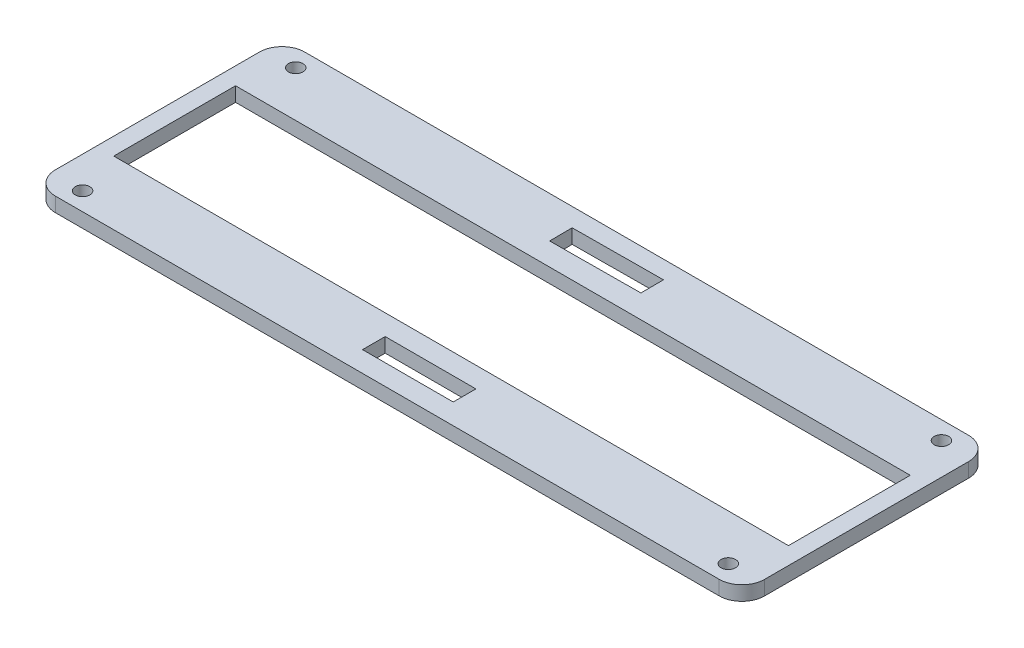
ISO-10303-21;
HEADER;
FILE_DESCRIPTION(('STEP AP214'),'2;1');
FILE_NAME('part.step','',(''),(''),'','','');
FILE_SCHEMA(('AUTOMOTIVE_DESIGN { 1 0 10303 214 1 1 1 1 }'));
ENDSEC;
DATA;
#1=APPLICATION_CONTEXT('core data for automotive mechanical design processes');
#2=APPLICATION_PROTOCOL_DEFINITION('international standard','automotive_design',2000,#1);
#3=PRODUCT_CONTEXT('',#1,'mechanical');
#4=PRODUCT('Part','Part','',(#3));
#5=PRODUCT_RELATED_PRODUCT_CATEGORY('part','',(#4));
#6=PRODUCT_DEFINITION_FORMATION('','',#4);
#7=PRODUCT_DEFINITION_CONTEXT('part definition',#1,'design');
#8=PRODUCT_DEFINITION('design','',#6,#7);
#9=PRODUCT_DEFINITION_SHAPE('','',#8);
#10=(LENGTH_UNIT() NAMED_UNIT(*) SI_UNIT(.MILLI.,.METRE.));
#11=(NAMED_UNIT(*) PLANE_ANGLE_UNIT() SI_UNIT($,.RADIAN.));
#12=(NAMED_UNIT(*) SI_UNIT($,.STERADIAN.) SOLID_ANGLE_UNIT());
#13=UNCERTAINTY_MEASURE_WITH_UNIT(LENGTH_MEASURE(1.E-05),#10,'distance_accuracy_value','');
#14=(GEOMETRIC_REPRESENTATION_CONTEXT(3) GLOBAL_UNCERTAINTY_ASSIGNED_CONTEXT((#13)) GLOBAL_UNIT_ASSIGNED_CONTEXT((#10,
#11,#12)) REPRESENTATION_CONTEXT('',''));
#15=CARTESIAN_POINT('',(0.,0.,0.));
#16=DIRECTION('',(0.,0.,1.));
#17=DIRECTION('',(1.,0.,0.));
#18=AXIS2_PLACEMENT_3D('',#15,#16,#17);
#19=CARTESIAN_POINT('',(78.2,3.175,-27.5));
#20=DIRECTION('',(-1.,0.,0.));
#21=DIRECTION('',(0.,0.,1.));
#22=AXIS2_PLACEMENT_3D('',#19,#20,#21);
#23=PLANE('',#22);
#24=DIRECTION('',(0.,0.,-1.));
#25=VECTOR('',#24,1.);
#26=CARTESIAN_POINT('',(78.2,0.,-27.5));
#27=LINE('',#26,#25);
#28=CARTESIAN_POINT('',(78.2,0.,22.5));
#29=VERTEX_POINT('',#28);
#30=CARTESIAN_POINT('',(78.2,0.,-22.5));
#31=VERTEX_POINT('',#30);
#32=EDGE_CURVE('E297',#29,#31,#27,.T.);
#33=ORIENTED_EDGE('',*,*,#32,.T.);
#34=DIRECTION('',(0.,-1.,0.));
#35=VECTOR('',#34,1.);
#36=CARTESIAN_POINT('',(78.2,3.175,-22.5));
#37=LINE('',#36,#35);
#38=CARTESIAN_POINT('',(78.2,3.175,-22.5));
#39=VERTEX_POINT('',#38);
#40=EDGE_CURVE('E43',#31,#39,#37,.F.);
#41=ORIENTED_EDGE('',*,*,#40,.T.);
#42=DIRECTION('',(0.,0.,-1.));
#43=VECTOR('',#42,1.);
#44=CARTESIAN_POINT('',(78.2,3.175,-27.5));
#45=LINE('',#44,#43);
#46=CARTESIAN_POINT('',(78.2,3.175,22.5));
#47=VERTEX_POINT('',#46);
#48=EDGE_CURVE('E304',#47,#39,#45,.T.);
#49=ORIENTED_EDGE('',*,*,#48,.F.);
#50=DIRECTION('',(0.,-1.,0.));
#51=VECTOR('',#50,1.);
#52=CARTESIAN_POINT('',(78.2,3.175,22.5));
#53=LINE('',#52,#51);
#54=EDGE_CURVE('E349',#47,#29,#53,.T.);
#55=ORIENTED_EDGE('',*,*,#54,.T.);
#56=EDGE_LOOP('',(#33,#41,#49,#55));
#57=FACE_BOUND('',#56,.T.);
#58=ADVANCED_FACE('F35',(#57),#23,.F.);
#59=CARTESIAN_POINT('',(-78.2,3.175,-27.5));
#60=DIRECTION('',(0.,0.,1.));
#61=DIRECTION('',(1.,0.,0.));
#62=AXIS2_PLACEMENT_3D('',#59,#60,#61);
#63=PLANE('',#62);
#64=DIRECTION('',(-1.,0.,0.));
#65=VECTOR('',#64,1.);
#66=CARTESIAN_POINT('',(-78.2,3.175,-27.5));
#67=LINE('',#66,#65);
#68=CARTESIAN_POINT('',(73.2,3.175,-27.5));
#69=VERTEX_POINT('',#68);
#70=CARTESIAN_POINT('',(-73.2,3.175,-27.5));
#71=VERTEX_POINT('',#70);
#72=EDGE_CURVE('E306',#69,#71,#67,.T.);
#73=ORIENTED_EDGE('',*,*,#72,.F.);
#74=DIRECTION('',(0.,-1.,0.));
#75=VECTOR('',#74,1.);
#76=CARTESIAN_POINT('',(73.2,3.175,-27.5));
#77=LINE('',#76,#75);
#78=CARTESIAN_POINT('',(73.2,0.,-27.5));
#79=VERTEX_POINT('',#78);
#80=EDGE_CURVE('E352',#69,#79,#77,.T.);
#81=ORIENTED_EDGE('',*,*,#80,.T.);
#82=DIRECTION('',(-1.,0.,0.));
#83=VECTOR('',#82,1.);
#84=CARTESIAN_POINT('',(-78.2,0.,-27.5));
#85=LINE('',#84,#83);
#86=CARTESIAN_POINT('',(-73.2,0.,-27.5));
#87=VERTEX_POINT('',#86);
#88=EDGE_CURVE('E317',#79,#87,#85,.T.);
#89=ORIENTED_EDGE('',*,*,#88,.T.);
#90=DIRECTION('',(0.,-1.,0.));
#91=VECTOR('',#90,1.);
#92=CARTESIAN_POINT('',(-73.2,3.175,-27.5));
#93=LINE('',#92,#91);
#94=EDGE_CURVE('E346',#87,#71,#93,.F.);
#95=ORIENTED_EDGE('',*,*,#94,.T.);
#96=EDGE_LOOP('',(#73,#81,#89,#95));
#97=FACE_BOUND('',#96,.T.);
#98=ADVANCED_FACE('F358',(#97),#63,.F.);
#99=CARTESIAN_POINT('',(-78.2,3.175,-27.5));
#100=DIRECTION('',(1.,0.,0.));
#101=DIRECTION('',(0.,0.,-1.));
#102=AXIS2_PLACEMENT_3D('',#99,#100,#101);
#103=PLANE('',#102);
#104=DIRECTION('',(0.,0.,1.));
#105=VECTOR('',#104,1.);
#106=CARTESIAN_POINT('',(-78.2,0.,-27.5));
#107=LINE('',#106,#105);
#108=CARTESIAN_POINT('',(-78.2,0.,-22.5));
#109=VERTEX_POINT('',#108);
#110=CARTESIAN_POINT('',(-78.2,0.,22.5));
#111=VERTEX_POINT('',#110);
#112=EDGE_CURVE('E319',#109,#111,#107,.T.);
#113=ORIENTED_EDGE('',*,*,#112,.T.);
#114=DIRECTION('',(0.,-1.,0.));
#115=VECTOR('',#114,1.);
#116=CARTESIAN_POINT('',(-78.2,3.175,22.5));
#117=LINE('',#116,#115);
#118=CARTESIAN_POINT('',(-78.2,3.175,22.5));
#119=VERTEX_POINT('',#118);
#120=EDGE_CURVE('E338',#111,#119,#117,.F.);
#121=ORIENTED_EDGE('',*,*,#120,.T.);
#122=DIRECTION('',(0.,0.,1.));
#123=VECTOR('',#122,1.);
#124=CARTESIAN_POINT('',(-78.2,3.175,-27.5));
#125=LINE('',#124,#123);
#126=CARTESIAN_POINT('',(-78.2,3.175,-22.5));
#127=VERTEX_POINT('',#126);
#128=EDGE_CURVE('E309',#127,#119,#125,.T.);
#129=ORIENTED_EDGE('',*,*,#128,.F.);
#130=DIRECTION('',(0.,-1.,0.));
#131=VECTOR('',#130,1.);
#132=CARTESIAN_POINT('',(-78.2,3.175,-22.5));
#133=LINE('',#132,#131);
#134=EDGE_CURVE('E335',#127,#109,#133,.T.);
#135=ORIENTED_EDGE('',*,*,#134,.T.);
#136=EDGE_LOOP('',(#113,#121,#129,#135));
#137=FACE_BOUND('',#136,.T.);
#138=ADVANCED_FACE('F372',(#137),#103,.F.);
#139=CARTESIAN_POINT('',(-78.2,3.175,27.5));
#140=DIRECTION('',(0.,0.,-1.));
#141=DIRECTION('',(-1.,0.,0.));
#142=AXIS2_PLACEMENT_3D('',#139,#140,#141);
#143=PLANE('',#142);
#144=DIRECTION('',(1.,0.,0.));
#145=VECTOR('',#144,1.);
#146=CARTESIAN_POINT('',(-78.2,3.175,27.5));
#147=LINE('',#146,#145);
#148=CARTESIAN_POINT('',(-73.2,3.175,27.5));
#149=VERTEX_POINT('',#148);
#150=CARTESIAN_POINT('',(73.2,3.175,27.5));
#151=VERTEX_POINT('',#150);
#152=EDGE_CURVE('E312',#149,#151,#147,.T.);
#153=ORIENTED_EDGE('',*,*,#152,.F.);
#154=DIRECTION('',(0.,-1.,0.));
#155=VECTOR('',#154,1.);
#156=CARTESIAN_POINT('',(-73.2,3.175,27.5));
#157=LINE('',#156,#155);
#158=CARTESIAN_POINT('',(-73.2,0.,27.5));
#159=VERTEX_POINT('',#158);
#160=EDGE_CURVE('E325',#149,#159,#157,.T.);
#161=ORIENTED_EDGE('',*,*,#160,.T.);
#162=DIRECTION('',(1.,0.,0.));
#163=VECTOR('',#162,1.);
#164=CARTESIAN_POINT('',(-78.2,0.,27.5));
#165=LINE('',#164,#163);
#166=CARTESIAN_POINT('',(73.2,0.,27.5));
#167=VERTEX_POINT('',#166);
#168=EDGE_CURVE('E307',#159,#167,#165,.T.);
#169=ORIENTED_EDGE('',*,*,#168,.T.);
#170=DIRECTION('',(0.,-1.,0.));
#171=VECTOR('',#170,1.);
#172=CARTESIAN_POINT('',(73.2,3.175,27.5));
#173=LINE('',#172,#171);
#174=EDGE_CURVE('E315',#167,#151,#173,.F.);
#175=ORIENTED_EDGE('',*,*,#174,.T.);
#176=EDGE_LOOP('',(#153,#161,#169,#175));
#177=FACE_BOUND('',#176,.T.);
#178=ADVANCED_FACE('F380',(#177),#143,.F.);
#179=CARTESIAN_POINT('',(0.,3.175,0.));
#180=DIRECTION('',(0.,1.,0.));
#181=DIRECTION('',(0.,0.,1.));
#182=AXIS2_PLACEMENT_3D('',#179,#180,#181);
#183=PLANE('',#182);
#184=DIRECTION('',(-0.999977725517235,0.,0.00667446397672328));
#185=VECTOR('',#184,1.);
#186=CARTESIAN_POINT('',(-10.15479818495,3.175,-23.4196869097158));
#187=LINE('',#186,#185);
#188=CARTESIAN_POINT('',(9.8447563253947,3.175,-23.5531761892503));
#189=VERTEX_POINT('',#188);
#190=CARTESIAN_POINT('',(-10.15479818495,3.175,-23.4196869097158));
#191=VERTEX_POINT('',#190);
#192=EDGE_CURVE('E179',#189,#191,#187,.T.);
#193=ORIENTED_EDGE('',*,*,#192,.F.);
#194=DIRECTION('',(-0.00667446397672467,0.,-0.999977725517236));
#195=VECTOR('',#194,1.);
#196=CARTESIAN_POINT('',(9.8447563253947,3.175,-23.5531761892503));
#197=LINE('',#196,#195);
#198=CARTESIAN_POINT('',(9.87812864527832,3.175,-18.5532875616641));
#199=VERTEX_POINT('',#198);
#200=EDGE_CURVE('E197',#199,#189,#197,.T.);
#201=ORIENTED_EDGE('',*,*,#200,.F.);
#202=DIRECTION('',(0.999977725517235,0.,-0.00667446397672363));
#203=VECTOR('',#202,1.);
#204=CARTESIAN_POINT('',(-10.1214258650664,3.175,-18.4197982821296));
#205=LINE('',#204,#203);
#206=CARTESIAN_POINT('',(-10.1214258650664,3.175,-18.4197982821296));
#207=VERTEX_POINT('',#206);
#208=EDGE_CURVE('E200',#207,#199,#205,.T.);
#209=ORIENTED_EDGE('',*,*,#208,.F.);
#210=DIRECTION('',(0.00667446397672466,0.,0.999977725517236));
#211=VECTOR('',#210,1.);
#212=CARTESIAN_POINT('',(-10.15479818495,3.175,-23.4196869097158));
#213=LINE('',#212,#211);
#214=EDGE_CURVE('E206',#191,#207,#213,.T.);
#215=ORIENTED_EDGE('',*,*,#214,.F.);
#216=EDGE_LOOP('',(#193,#201,#209,#215));
#217=FACE_BOUND('',#216,.T.);
#218=DIRECTION('',(0.,0.,-1.));
#219=VECTOR('',#218,1.);
#220=CARTESIAN_POINT('',(9.99999999999999,3.175,22.965));
#221=LINE('',#220,#219);
#222=CARTESIAN_POINT('',(9.99999999999999,3.175,22.965));
#223=VERTEX_POINT('',#222);
#224=CARTESIAN_POINT('',(9.99999999999999,3.175,17.965));
#225=VERTEX_POINT('',#224);
#226=EDGE_CURVE('E212',#223,#225,#221,.T.);
#227=ORIENTED_EDGE('',*,*,#226,.F.);
#228=DIRECTION('',(1.,0.,0.));
#229=VECTOR('',#228,1.);
#230=CARTESIAN_POINT('',(-10.,3.175,22.965));
#231=LINE('',#230,#229);
#232=CARTESIAN_POINT('',(-10.,3.175,22.965));
#233=VERTEX_POINT('',#232);
#234=EDGE_CURVE('E220',#233,#223,#231,.T.);
#235=ORIENTED_EDGE('',*,*,#234,.F.);
#236=DIRECTION('',(0.,0.,1.));
#237=VECTOR('',#236,1.);
#238=CARTESIAN_POINT('',(-10.,3.175,22.965));
#239=LINE('',#238,#237);
#240=CARTESIAN_POINT('',(-10.,3.175,17.965));
#241=VERTEX_POINT('',#240);
#242=EDGE_CURVE('E234',#241,#233,#239,.T.);
#243=ORIENTED_EDGE('',*,*,#242,.F.);
#244=DIRECTION('',(-1.,0.,0.));
#245=VECTOR('',#244,1.);
#246=CARTESIAN_POINT('',(-10.,3.175,17.965));
#247=LINE('',#246,#245);
#248=EDGE_CURVE('E231',#225,#241,#247,.T.);
#249=ORIENTED_EDGE('',*,*,#248,.F.);
#250=EDGE_LOOP('',(#227,#235,#243,#249));
#251=FACE_BOUND('',#250,.T.);
#252=CARTESIAN_POINT('',(71.2,3.175,23.5));
#253=DIRECTION('',(0.,1.,0.));
#254=DIRECTION('',(0.,0.,-1.));
#255=AXIS2_PLACEMENT_3D('',#252,#253,#254);
#256=CIRCLE('',#255,1.6);
#257=CARTESIAN_POINT('',(71.2,3.175,21.9));
#258=VERTEX_POINT('',#257);
#259=EDGE_CURVE('E241',#258,#258,#256,.T.);
#260=ORIENTED_EDGE('',*,*,#259,.F.);
#261=EDGE_LOOP('',(#260));
#262=FACE_BOUND('',#261,.T.);
#263=CARTESIAN_POINT('',(71.2,3.175,-23.5));
#264=DIRECTION('',(0.,1.,0.));
#265=DIRECTION('',(0.,0.,1.));
#266=AXIS2_PLACEMENT_3D('',#263,#264,#265);
#267=CIRCLE('',#266,1.6);
#268=CARTESIAN_POINT('',(71.2,3.175,-21.9));
#269=VERTEX_POINT('',#268);
#270=EDGE_CURVE('E251',#269,#269,#267,.T.);
#271=ORIENTED_EDGE('',*,*,#270,.F.);
#272=EDGE_LOOP('',(#271));
#273=FACE_BOUND('',#272,.T.);
#274=CARTESIAN_POINT('',(-71.2,3.175,-23.5));
#275=DIRECTION('',(0.,1.,0.));
#276=DIRECTION('',(0.,0.,-1.));
#277=AXIS2_PLACEMENT_3D('',#274,#275,#276);
#278=CIRCLE('',#277,1.6);
#279=CARTESIAN_POINT('',(-71.2,3.175,-25.1));
#280=VERTEX_POINT('',#279);
#281=EDGE_CURVE('E257',#280,#280,#278,.T.);
#282=ORIENTED_EDGE('',*,*,#281,.F.);
#283=EDGE_LOOP('',(#282));
#284=FACE_BOUND('',#283,.T.);
#285=CARTESIAN_POINT('',(-71.2,3.175,23.5));
#286=DIRECTION('',(0.,1.,0.));
#287=DIRECTION('',(0.,0.,1.));
#288=AXIS2_PLACEMENT_3D('',#285,#286,#287);
#289=CIRCLE('',#288,1.6);
#290=CARTESIAN_POINT('',(-71.2,3.175,25.1));
#291=VERTEX_POINT('',#290);
#292=EDGE_CURVE('E263',#291,#291,#289,.T.);
#293=ORIENTED_EDGE('',*,*,#292,.F.);
#294=EDGE_LOOP('',(#293));
#295=FACE_BOUND('',#294,.T.);
#296=DIRECTION('',(0.,0.,-1.));
#297=VECTOR('',#296,1.);
#298=CARTESIAN_POINT('',(-74.39,3.175,13.4299999999999));
#299=LINE('',#298,#297);
#300=CARTESIAN_POINT('',(-74.39,3.175,13.4299999999999));
#301=VERTEX_POINT('',#300);
#302=CARTESIAN_POINT('',(-74.39,3.175,-13.4300000000001));
#303=VERTEX_POINT('',#302);
#304=EDGE_CURVE('E272',#301,#303,#299,.T.);
#305=ORIENTED_EDGE('',*,*,#304,.T.);
#306=DIRECTION('',(1.,0.,0.));
#307=VECTOR('',#306,1.);
#308=CARTESIAN_POINT('',(-74.39,3.175,-13.4300000000001));
#309=LINE('',#308,#307);
#310=CARTESIAN_POINT('',(74.39,3.175,-13.4300000000001));
#311=VERTEX_POINT('',#310);
#312=EDGE_CURVE('E275',#303,#311,#309,.T.);
#313=ORIENTED_EDGE('',*,*,#312,.T.);
#314=DIRECTION('',(0.,0.,1.));
#315=VECTOR('',#314,1.);
#316=CARTESIAN_POINT('',(74.39,3.175,13.4299999999999));
#317=LINE('',#316,#315);
#318=CARTESIAN_POINT('',(74.39,3.175,13.4299999999999));
#319=VERTEX_POINT('',#318);
#320=EDGE_CURVE('E279',#311,#319,#317,.T.);
#321=ORIENTED_EDGE('',*,*,#320,.T.);
#322=DIRECTION('',(-1.,0.,0.));
#323=VECTOR('',#322,1.);
#324=CARTESIAN_POINT('',(-74.39,3.175,13.4299999999999));
#325=LINE('',#324,#323);
#326=EDGE_CURVE('E282',#319,#301,#325,.T.);
#327=ORIENTED_EDGE('',*,*,#326,.T.);
#328=EDGE_LOOP('',(#305,#313,#321,#327));
#329=FACE_BOUND('',#328,.T.);
#330=ORIENTED_EDGE('',*,*,#48,.T.);
#331=CARTESIAN_POINT('',(73.2,3.175,-22.5));
#332=DIRECTION('',(0.,1.,0.));
#333=DIRECTION('',(0.,0.,1.));
#334=AXIS2_PLACEMENT_3D('',#331,#332,#333);
#335=CIRCLE('',#334,5.);
#336=EDGE_CURVE('E11',#39,#69,#335,.T.);
#337=ORIENTED_EDGE('',*,*,#336,.T.);
#338=ORIENTED_EDGE('',*,*,#72,.T.);
#339=CARTESIAN_POINT('',(-73.2,3.175,-22.5));
#340=DIRECTION('',(0.,1.,0.));
#341=DIRECTION('',(0.,0.,1.));
#342=AXIS2_PLACEMENT_3D('',#339,#340,#341);
#343=CIRCLE('',#342,5.);
#344=EDGE_CURVE('E342',#71,#127,#343,.T.);
#345=ORIENTED_EDGE('',*,*,#344,.T.);
#346=ORIENTED_EDGE('',*,*,#128,.T.);
#347=CARTESIAN_POINT('',(-73.2,3.175,22.5));
#348=DIRECTION('',(0.,1.,0.));
#349=DIRECTION('',(0.,0.,1.));
#350=AXIS2_PLACEMENT_3D('',#347,#348,#349);
#351=CIRCLE('',#350,5.);
#352=EDGE_CURVE('E344',#119,#149,#351,.T.);
#353=ORIENTED_EDGE('',*,*,#352,.T.);
#354=ORIENTED_EDGE('',*,*,#152,.T.);
#355=CARTESIAN_POINT('',(73.2,3.175,22.5));
#356=DIRECTION('',(0.,1.,0.));
#357=DIRECTION('',(0.,0.,1.));
#358=AXIS2_PLACEMENT_3D('',#355,#356,#357);
#359=CIRCLE('',#358,5.);
#360=EDGE_CURVE('E340',#151,#47,#359,.T.);
#361=ORIENTED_EDGE('',*,*,#360,.T.);
#362=EDGE_LOOP('',(#330,#337,#338,#345,#346,#353,#354,#361));
#363=FACE_BOUND('',#362,.T.);
#364=ADVANCED_FACE('F369',(#217,#251,#262,#273,#284,#295,#329,#363),#183,.T.);
#365=CARTESIAN_POINT('',(0.,0.,0.));
#366=DIRECTION('',(0.,1.,0.));
#367=DIRECTION('',(0.,0.,1.));
#368=AXIS2_PLACEMENT_3D('',#365,#366,#367);
#369=PLANE('',#368);
#370=DIRECTION('',(-0.00667446397672467,0.,-0.999977725517236));
#371=VECTOR('',#370,1.);
#372=CARTESIAN_POINT('',(9.8447563253947,0.,-23.5531761892503));
#373=LINE('',#372,#371);
#374=CARTESIAN_POINT('',(9.87812864527832,0.,-18.5532875616641));
#375=VERTEX_POINT('',#374);
#376=CARTESIAN_POINT('',(9.8447563253947,0.,-23.5531761892503));
#377=VERTEX_POINT('',#376);
#378=EDGE_CURVE('E184',#375,#377,#373,.T.);
#379=ORIENTED_EDGE('',*,*,#378,.T.);
#380=DIRECTION('',(-0.999977725517235,0.,0.00667446397672328));
#381=VECTOR('',#380,1.);
#382=CARTESIAN_POINT('',(-10.15479818495,0.,-23.4196869097158));
#383=LINE('',#382,#381);
#384=CARTESIAN_POINT('',(-10.15479818495,0.,-23.4196869097158));
#385=VERTEX_POINT('',#384);
#386=EDGE_CURVE('E176',#377,#385,#383,.T.);
#387=ORIENTED_EDGE('',*,*,#386,.T.);
#388=DIRECTION('',(0.00667446397672466,0.,0.999977725517236));
#389=VECTOR('',#388,1.);
#390=CARTESIAN_POINT('',(-10.15479818495,0.,-23.4196869097158));
#391=LINE('',#390,#389);
#392=CARTESIAN_POINT('',(-10.1214258650664,0.,-18.4197982821296));
#393=VERTEX_POINT('',#392);
#394=EDGE_CURVE('E188',#385,#393,#391,.T.);
#395=ORIENTED_EDGE('',*,*,#394,.T.);
#396=DIRECTION('',(0.999977725517235,0.,-0.00667446397672363));
#397=VECTOR('',#396,1.);
#398=CARTESIAN_POINT('',(-10.1214258650664,0.,-18.4197982821296));
#399=LINE('',#398,#397);
#400=EDGE_CURVE('E192',#393,#375,#399,.T.);
#401=ORIENTED_EDGE('',*,*,#400,.T.);
#402=EDGE_LOOP('',(#379,#387,#395,#401));
#403=FACE_BOUND('',#402,.T.);
#404=DIRECTION('',(1.,0.,0.));
#405=VECTOR('',#404,1.);
#406=CARTESIAN_POINT('',(-10.,0.,22.965));
#407=LINE('',#406,#405);
#408=CARTESIAN_POINT('',(-10.,0.,22.965));
#409=VERTEX_POINT('',#408);
#410=CARTESIAN_POINT('',(9.99999999999999,0.,22.965));
#411=VERTEX_POINT('',#410);
#412=EDGE_CURVE('E226',#409,#411,#407,.T.);
#413=ORIENTED_EDGE('',*,*,#412,.T.);
#414=DIRECTION('',(0.,0.,-1.));
#415=VECTOR('',#414,1.);
#416=CARTESIAN_POINT('',(9.99999999999999,0.,22.965));
#417=LINE('',#416,#415);
#418=CARTESIAN_POINT('',(9.99999999999999,0.,17.965));
#419=VERTEX_POINT('',#418);
#420=EDGE_CURVE('E216',#411,#419,#417,.T.);
#421=ORIENTED_EDGE('',*,*,#420,.T.);
#422=DIRECTION('',(-1.,0.,0.));
#423=VECTOR('',#422,1.);
#424=CARTESIAN_POINT('',(-10.,0.,17.965));
#425=LINE('',#424,#423);
#426=CARTESIAN_POINT('',(-10.,0.,17.965));
#427=VERTEX_POINT('',#426);
#428=EDGE_CURVE('E219',#419,#427,#425,.T.);
#429=ORIENTED_EDGE('',*,*,#428,.T.);
#430=DIRECTION('',(0.,0.,1.));
#431=VECTOR('',#430,1.);
#432=CARTESIAN_POINT('',(-10.,0.,22.965));
#433=LINE('',#432,#431);
#434=EDGE_CURVE('E223',#427,#409,#433,.T.);
#435=ORIENTED_EDGE('',*,*,#434,.T.);
#436=EDGE_LOOP('',(#413,#421,#429,#435));
#437=FACE_BOUND('',#436,.T.);
#438=CARTESIAN_POINT('',(71.2,0.,23.5));
#439=DIRECTION('',(0.,1.,0.));
#440=DIRECTION('',(0.,0.,-1.));
#441=AXIS2_PLACEMENT_3D('',#438,#439,#440);
#442=CIRCLE('',#441,1.6);
#443=CARTESIAN_POINT('',(71.2,0.,21.9));
#444=VERTEX_POINT('',#443);
#445=EDGE_CURVE('E248',#444,#444,#442,.T.);
#446=ORIENTED_EDGE('',*,*,#445,.T.);
#447=EDGE_LOOP('',(#446));
#448=FACE_BOUND('',#447,.T.);
#449=CARTESIAN_POINT('',(71.2,0.,-23.5));
#450=DIRECTION('',(0.,1.,0.));
#451=DIRECTION('',(0.,0.,1.));
#452=AXIS2_PLACEMENT_3D('',#449,#450,#451);
#453=CIRCLE('',#452,1.6);
#454=CARTESIAN_POINT('',(71.2,0.,-21.9));
#455=VERTEX_POINT('',#454);
#456=EDGE_CURVE('E254',#455,#455,#453,.T.);
#457=ORIENTED_EDGE('',*,*,#456,.T.);
#458=EDGE_LOOP('',(#457));
#459=FACE_BOUND('',#458,.T.);
#460=CARTESIAN_POINT('',(-71.2,0.,-23.5));
#461=DIRECTION('',(0.,1.,0.));
#462=DIRECTION('',(0.,0.,-1.));
#463=AXIS2_PLACEMENT_3D('',#460,#461,#462);
#464=CIRCLE('',#463,1.6);
#465=CARTESIAN_POINT('',(-71.2,0.,-25.1));
#466=VERTEX_POINT('',#465);
#467=EDGE_CURVE('E260',#466,#466,#464,.T.);
#468=ORIENTED_EDGE('',*,*,#467,.T.);
#469=EDGE_LOOP('',(#468));
#470=FACE_BOUND('',#469,.T.);
#471=CARTESIAN_POINT('',(-71.2,0.,23.5));
#472=DIRECTION('',(0.,1.,0.));
#473=DIRECTION('',(0.,0.,1.));
#474=AXIS2_PLACEMENT_3D('',#471,#472,#473);
#475=CIRCLE('',#474,1.6);
#476=CARTESIAN_POINT('',(-71.2,0.,25.1));
#477=VERTEX_POINT('',#476);
#478=EDGE_CURVE('E266',#477,#477,#475,.T.);
#479=ORIENTED_EDGE('',*,*,#478,.T.);
#480=EDGE_LOOP('',(#479));
#481=FACE_BOUND('',#480,.T.);
#482=DIRECTION('',(1.,0.,0.));
#483=VECTOR('',#482,1.);
#484=CARTESIAN_POINT('',(-74.39,0.,-13.4300000000001));
#485=LINE('',#484,#483);
#486=CARTESIAN_POINT('',(-74.39,0.,-13.4300000000001));
#487=VERTEX_POINT('',#486);
#488=CARTESIAN_POINT('',(74.39,0.,-13.4300000000001));
#489=VERTEX_POINT('',#488);
#490=EDGE_CURVE('E287',#487,#489,#485,.T.);
#491=ORIENTED_EDGE('',*,*,#490,.F.);
#492=DIRECTION('',(0.,0.,-1.));
#493=VECTOR('',#492,1.);
#494=CARTESIAN_POINT('',(-74.39,0.,13.4299999999999));
#495=LINE('',#494,#493);
#496=CARTESIAN_POINT('',(-74.39,0.,13.4299999999999));
#497=VERTEX_POINT('',#496);
#498=EDGE_CURVE('E269',#497,#487,#495,.T.);
#499=ORIENTED_EDGE('',*,*,#498,.F.);
#500=DIRECTION('',(-1.,0.,0.));
#501=VECTOR('',#500,1.);
#502=CARTESIAN_POINT('',(-74.39,0.,13.4299999999999));
#503=LINE('',#502,#501);
#504=CARTESIAN_POINT('',(74.39,0.,13.4299999999999));
#505=VERTEX_POINT('',#504);
#506=EDGE_CURVE('E276',#505,#497,#503,.T.);
#507=ORIENTED_EDGE('',*,*,#506,.F.);
#508=DIRECTION('',(0.,0.,1.));
#509=VECTOR('',#508,1.);
#510=CARTESIAN_POINT('',(74.39,0.,13.4299999999999));
#511=LINE('',#510,#509);
#512=EDGE_CURVE('E290',#489,#505,#511,.T.);
#513=ORIENTED_EDGE('',*,*,#512,.F.);
#514=EDGE_LOOP('',(#491,#499,#507,#513));
#515=FACE_BOUND('',#514,.T.);
#516=ORIENTED_EDGE('',*,*,#88,.F.);
#517=CARTESIAN_POINT('',(73.2,0.,-22.5));
#518=DIRECTION('',(0.,1.,0.));
#519=DIRECTION('',(0.,0.,1.));
#520=AXIS2_PLACEMENT_3D('',#517,#518,#519);
#521=CIRCLE('',#520,5.);
#522=EDGE_CURVE('E57',#79,#31,#521,.F.);
#523=ORIENTED_EDGE('',*,*,#522,.T.);
#524=ORIENTED_EDGE('',*,*,#32,.F.);
#525=CARTESIAN_POINT('',(73.2,0.,22.5));
#526=DIRECTION('',(0.,1.,0.));
#527=DIRECTION('',(0.,0.,1.));
#528=AXIS2_PLACEMENT_3D('',#525,#526,#527);
#529=CIRCLE('',#528,5.);
#530=EDGE_CURVE('E328',#29,#167,#529,.F.);
#531=ORIENTED_EDGE('',*,*,#530,.T.);
#532=ORIENTED_EDGE('',*,*,#168,.F.);
#533=CARTESIAN_POINT('',(-73.2,0.,22.5));
#534=DIRECTION('',(0.,1.,0.));
#535=DIRECTION('',(0.,0.,1.));
#536=AXIS2_PLACEMENT_3D('',#533,#534,#535);
#537=CIRCLE('',#536,5.);
#538=EDGE_CURVE('E333',#159,#111,#537,.F.);
#539=ORIENTED_EDGE('',*,*,#538,.T.);
#540=ORIENTED_EDGE('',*,*,#112,.F.);
#541=CARTESIAN_POINT('',(-73.2,0.,-22.5));
#542=DIRECTION('',(0.,1.,0.));
#543=DIRECTION('',(0.,0.,1.));
#544=AXIS2_PLACEMENT_3D('',#541,#542,#543);
#545=CIRCLE('',#544,5.);
#546=EDGE_CURVE('E330',#109,#87,#545,.F.);
#547=ORIENTED_EDGE('',*,*,#546,.T.);
#548=EDGE_LOOP('',(#516,#523,#524,#531,#532,#539,#540,#547));
#549=FACE_BOUND('',#548,.T.);
#550=ADVANCED_FACE('F194',(#403,#437,#448,#459,#470,#481,#515,#549),#369,.F.);
#551=CARTESIAN_POINT('',(-74.39,3.175,13.4299999999999));
#552=DIRECTION('',(-1.,0.,0.));
#553=DIRECTION('',(0.,0.,1.));
#554=AXIS2_PLACEMENT_3D('',#551,#552,#553);
#555=PLANE('',#554);
#556=ORIENTED_EDGE('',*,*,#498,.T.);
#557=DIRECTION('',(0.,-1.,0.));
#558=VECTOR('',#557,1.);
#559=CARTESIAN_POINT('',(-74.39,3.175,-13.4300000000001));
#560=LINE('',#559,#558);
#561=EDGE_CURVE('E285',#303,#487,#560,.T.);
#562=ORIENTED_EDGE('',*,*,#561,.F.);
#563=ORIENTED_EDGE('',*,*,#304,.F.);
#564=DIRECTION('',(0.,-1.,0.));
#565=VECTOR('',#564,1.);
#566=CARTESIAN_POINT('',(-74.39,3.175,13.4299999999999));
#567=LINE('',#566,#565);
#568=EDGE_CURVE('E295',#301,#497,#567,.T.);
#569=ORIENTED_EDGE('',*,*,#568,.T.);
#570=EDGE_LOOP('',(#556,#562,#563,#569));
#571=FACE_BOUND('',#570,.T.);
#572=ADVANCED_FACE('F426',(#571),#555,.F.);
#573=CARTESIAN_POINT('',(-74.39,3.175,13.4299999999999));
#574=DIRECTION('',(0.,0.,1.));
#575=DIRECTION('',(1.,0.,0.));
#576=AXIS2_PLACEMENT_3D('',#573,#574,#575);
#577=PLANE('',#576);
#578=ORIENTED_EDGE('',*,*,#506,.T.);
#579=ORIENTED_EDGE('',*,*,#568,.F.);
#580=ORIENTED_EDGE('',*,*,#326,.F.);
#581=DIRECTION('',(0.,-1.,0.));
#582=VECTOR('',#581,1.);
#583=CARTESIAN_POINT('',(74.39,3.175,13.4299999999999));
#584=LINE('',#583,#582);
#585=EDGE_CURVE('E298',#319,#505,#584,.T.);
#586=ORIENTED_EDGE('',*,*,#585,.T.);
#587=EDGE_LOOP('',(#578,#579,#580,#586));
#588=FACE_BOUND('',#587,.T.);
#589=ADVANCED_FACE('F582',(#588),#577,.F.);
#590=CARTESIAN_POINT('',(74.39,3.175,13.4299999999999));
#591=DIRECTION('',(1.,0.,0.));
#592=DIRECTION('',(0.,0.,-1.));
#593=AXIS2_PLACEMENT_3D('',#590,#591,#592);
#594=PLANE('',#593);
#595=ORIENTED_EDGE('',*,*,#512,.T.);
#596=ORIENTED_EDGE('',*,*,#585,.F.);
#597=ORIENTED_EDGE('',*,*,#320,.F.);
#598=DIRECTION('',(0.,-1.,0.));
#599=VECTOR('',#598,1.);
#600=CARTESIAN_POINT('',(74.39,3.175,-13.4300000000001));
#601=LINE('',#600,#599);
#602=EDGE_CURVE('E300',#311,#489,#601,.T.);
#603=ORIENTED_EDGE('',*,*,#602,.T.);
#604=EDGE_LOOP('',(#595,#596,#597,#603));
#605=FACE_BOUND('',#604,.T.);
#606=ADVANCED_FACE('F573',(#605),#594,.F.);
#607=CARTESIAN_POINT('',(-74.39,3.175,-13.4300000000001));
#608=DIRECTION('',(0.,0.,-1.));
#609=DIRECTION('',(-1.,0.,0.));
#610=AXIS2_PLACEMENT_3D('',#607,#608,#609);
#611=PLANE('',#610);
#612=ORIENTED_EDGE('',*,*,#490,.T.);
#613=ORIENTED_EDGE('',*,*,#602,.F.);
#614=ORIENTED_EDGE('',*,*,#312,.F.);
#615=ORIENTED_EDGE('',*,*,#561,.T.);
#616=EDGE_LOOP('',(#612,#613,#614,#615));
#617=FACE_BOUND('',#616,.T.);
#618=ADVANCED_FACE('F564',(#617),#611,.F.);
#619=CARTESIAN_POINT('',(-71.2,0.,23.5));
#620=DIRECTION('',(0.,1.,0.));
#621=DIRECTION('',(0.,0.,1.));
#622=AXIS2_PLACEMENT_3D('',#619,#620,#621);
#623=CYLINDRICAL_SURFACE('',#622,1.6);
#624=ORIENTED_EDGE('',*,*,#478,.F.);
#625=EDGE_LOOP('',(#624));
#626=FACE_BOUND('',#625,.T.);
#627=ORIENTED_EDGE('',*,*,#292,.T.);
#628=EDGE_LOOP('',(#627));
#629=FACE_BOUND('',#628,.T.);
#630=ADVANCED_FACE('F555',(#626,#629),#623,.F.);
#631=CARTESIAN_POINT('',(-71.2,0.,-23.5));
#632=DIRECTION('',(0.,1.,0.));
#633=DIRECTION('',(0.,0.,1.));
#634=AXIS2_PLACEMENT_3D('',#631,#632,#633);
#635=CYLINDRICAL_SURFACE('',#634,1.6);
#636=ORIENTED_EDGE('',*,*,#467,.F.);
#637=EDGE_LOOP('',(#636));
#638=FACE_BOUND('',#637,.T.);
#639=ORIENTED_EDGE('',*,*,#281,.T.);
#640=EDGE_LOOP('',(#639));
#641=FACE_BOUND('',#640,.T.);
#642=ADVANCED_FACE('F546',(#638,#641),#635,.F.);
#643=CARTESIAN_POINT('',(71.2,0.,-23.5));
#644=DIRECTION('',(0.,1.,0.));
#645=DIRECTION('',(0.,0.,1.));
#646=AXIS2_PLACEMENT_3D('',#643,#644,#645);
#647=CYLINDRICAL_SURFACE('',#646,1.6);
#648=ORIENTED_EDGE('',*,*,#456,.F.);
#649=EDGE_LOOP('',(#648));
#650=FACE_BOUND('',#649,.T.);
#651=ORIENTED_EDGE('',*,*,#270,.T.);
#652=EDGE_LOOP('',(#651));
#653=FACE_BOUND('',#652,.T.);
#654=ADVANCED_FACE('F537',(#650,#653),#647,.F.);
#655=CARTESIAN_POINT('',(71.2,0.,23.5));
#656=DIRECTION('',(0.,1.,0.));
#657=DIRECTION('',(0.,0.,1.));
#658=AXIS2_PLACEMENT_3D('',#655,#656,#657);
#659=CYLINDRICAL_SURFACE('',#658,1.6);
#660=ORIENTED_EDGE('',*,*,#445,.F.);
#661=EDGE_LOOP('',(#660));
#662=FACE_BOUND('',#661,.T.);
#663=ORIENTED_EDGE('',*,*,#259,.T.);
#664=EDGE_LOOP('',(#663));
#665=FACE_BOUND('',#664,.T.);
#666=ADVANCED_FACE('F528',(#662,#665),#659,.F.);
#667=CARTESIAN_POINT('',(9.99999999999999,0.,22.965));
#668=DIRECTION('',(1.,0.,0.));
#669=DIRECTION('',(0.,0.,-1.));
#670=AXIS2_PLACEMENT_3D('',#667,#668,#669);
#671=PLANE('',#670);
#672=ORIENTED_EDGE('',*,*,#226,.T.);
#673=DIRECTION('',(0.,1.,0.));
#674=VECTOR('',#673,1.);
#675=CARTESIAN_POINT('',(9.99999999999999,0.,17.965));
#676=LINE('',#675,#674);
#677=EDGE_CURVE('E229',#419,#225,#676,.T.);
#678=ORIENTED_EDGE('',*,*,#677,.F.);
#679=ORIENTED_EDGE('',*,*,#420,.F.);
#680=DIRECTION('',(0.,1.,0.));
#681=VECTOR('',#680,1.);
#682=CARTESIAN_POINT('',(9.99999999999999,0.,22.965));
#683=LINE('',#682,#681);
#684=EDGE_CURVE('E239',#411,#223,#683,.T.);
#685=ORIENTED_EDGE('',*,*,#684,.T.);
#686=EDGE_LOOP('',(#672,#678,#679,#685));
#687=FACE_BOUND('',#686,.T.);
#688=ADVANCED_FACE('F519',(#687),#671,.F.);
#689=CARTESIAN_POINT('',(-10.,0.,22.965));
#690=DIRECTION('',(0.,0.,1.));
#691=DIRECTION('',(1.,0.,0.));
#692=AXIS2_PLACEMENT_3D('',#689,#690,#691);
#693=PLANE('',#692);
#694=ORIENTED_EDGE('',*,*,#234,.T.);
#695=ORIENTED_EDGE('',*,*,#684,.F.);
#696=ORIENTED_EDGE('',*,*,#412,.F.);
#697=DIRECTION('',(0.,1.,0.));
#698=VECTOR('',#697,1.);
#699=CARTESIAN_POINT('',(-10.,0.,22.965));
#700=LINE('',#699,#698);
#701=EDGE_CURVE('E242',#409,#233,#700,.T.);
#702=ORIENTED_EDGE('',*,*,#701,.T.);
#703=EDGE_LOOP('',(#694,#695,#696,#702));
#704=FACE_BOUND('',#703,.T.);
#705=ADVANCED_FACE('F510',(#704),#693,.F.);
#706=CARTESIAN_POINT('',(-10.,0.,22.965));
#707=DIRECTION('',(-1.,0.,0.));
#708=DIRECTION('',(0.,0.,1.));
#709=AXIS2_PLACEMENT_3D('',#706,#707,#708);
#710=PLANE('',#709);
#711=ORIENTED_EDGE('',*,*,#242,.T.);
#712=ORIENTED_EDGE('',*,*,#701,.F.);
#713=ORIENTED_EDGE('',*,*,#434,.F.);
#714=DIRECTION('',(0.,1.,0.));
#715=VECTOR('',#714,1.);
#716=CARTESIAN_POINT('',(-10.,0.,17.965));
#717=LINE('',#716,#715);
#718=EDGE_CURVE('E244',#427,#241,#717,.T.);
#719=ORIENTED_EDGE('',*,*,#718,.T.);
#720=EDGE_LOOP('',(#711,#712,#713,#719));
#721=FACE_BOUND('',#720,.T.);
#722=ADVANCED_FACE('F501',(#721),#710,.F.);
#723=CARTESIAN_POINT('',(-10.,0.,17.965));
#724=DIRECTION('',(0.,0.,-1.));
#725=DIRECTION('',(-1.,0.,0.));
#726=AXIS2_PLACEMENT_3D('',#723,#724,#725);
#727=PLANE('',#726);
#728=ORIENTED_EDGE('',*,*,#248,.T.);
#729=ORIENTED_EDGE('',*,*,#718,.F.);
#730=ORIENTED_EDGE('',*,*,#428,.F.);
#731=ORIENTED_EDGE('',*,*,#677,.T.);
#732=EDGE_LOOP('',(#728,#729,#730,#731));
#733=FACE_BOUND('',#732,.T.);
#734=ADVANCED_FACE('F493',(#733),#727,.F.);
#735=CARTESIAN_POINT('',(-10.15479818495,0.,-23.4196869097158));
#736=DIRECTION('',(-0.00667446397672328,0.,-0.999977725517235));
#737=DIRECTION('',(-0.999977725517235,0.,0.00667446397672328));
#738=AXIS2_PLACEMENT_3D('',#735,#736,#737);
#739=PLANE('',#738);
#740=ORIENTED_EDGE('',*,*,#192,.T.);
#741=DIRECTION('',(0.,1.,0.));
#742=VECTOR('',#741,1.);
#743=CARTESIAN_POINT('',(-10.15479818495,0.,-23.4196869097158));
#744=LINE('',#743,#742);
#745=EDGE_CURVE('E172',#385,#191,#744,.T.);
#746=ORIENTED_EDGE('',*,*,#745,.F.);
#747=ORIENTED_EDGE('',*,*,#386,.F.);
#748=DIRECTION('',(0.,1.,0.));
#749=VECTOR('',#748,1.);
#750=CARTESIAN_POINT('',(9.8447563253947,0.,-23.5531761892503));
#751=LINE('',#750,#749);
#752=EDGE_CURVE('E210',#377,#189,#751,.T.);
#753=ORIENTED_EDGE('',*,*,#752,.T.);
#754=EDGE_LOOP('',(#740,#746,#747,#753));
#755=FACE_BOUND('',#754,.T.);
#756=ADVANCED_FACE('F174',(#755),#739,.F.);
#757=CARTESIAN_POINT('',(9.8447563253947,0.,-23.5531761892503));
#758=DIRECTION('',(0.999977725517235,0.,-0.00667446397672467));
#759=DIRECTION('',(-0.00667446397672467,0.,-0.999977725517236));
#760=AXIS2_PLACEMENT_3D('',#757,#758,#759);
#761=PLANE('',#760);
#762=ORIENTED_EDGE('',*,*,#200,.T.);
#763=ORIENTED_EDGE('',*,*,#752,.F.);
#764=ORIENTED_EDGE('',*,*,#378,.F.);
#765=DIRECTION('',(0.,1.,0.));
#766=VECTOR('',#765,1.);
#767=CARTESIAN_POINT('',(9.87812864527832,0.,-18.5532875616641));
#768=LINE('',#767,#766);
#769=EDGE_CURVE('E213',#375,#199,#768,.T.);
#770=ORIENTED_EDGE('',*,*,#769,.T.);
#771=EDGE_LOOP('',(#762,#763,#764,#770));
#772=FACE_BOUND('',#771,.T.);
#773=ADVANCED_FACE('F476',(#772),#761,.F.);
#774=CARTESIAN_POINT('',(-10.1214258650664,0.,-18.4197982821296));
#775=DIRECTION('',(0.00667446397672363,0.,0.999977725517235));
#776=DIRECTION('',(0.999977725517235,0.,-0.00667446397672363));
#777=AXIS2_PLACEMENT_3D('',#774,#775,#776);
#778=PLANE('',#777);
#779=ORIENTED_EDGE('',*,*,#208,.T.);
#780=ORIENTED_EDGE('',*,*,#769,.F.);
#781=ORIENTED_EDGE('',*,*,#400,.F.);
#782=DIRECTION('',(0.,1.,0.));
#783=VECTOR('',#782,1.);
#784=CARTESIAN_POINT('',(-10.1214258650664,0.,-18.4197982821296));
#785=LINE('',#784,#783);
#786=EDGE_CURVE('E183',#393,#207,#785,.T.);
#787=ORIENTED_EDGE('',*,*,#786,.T.);
#788=EDGE_LOOP('',(#779,#780,#781,#787));
#789=FACE_BOUND('',#788,.T.);
#790=ADVANCED_FACE('F468',(#789),#778,.F.);
#791=CARTESIAN_POINT('',(-10.15479818495,0.,-23.4196869097158));
#792=DIRECTION('',(-0.999977725517235,0.,0.00667446397672466));
#793=DIRECTION('',(0.00667446397672466,0.,0.999977725517236));
#794=AXIS2_PLACEMENT_3D('',#791,#792,#793);
#795=PLANE('',#794);
#796=ORIENTED_EDGE('',*,*,#214,.T.);
#797=ORIENTED_EDGE('',*,*,#786,.F.);
#798=ORIENTED_EDGE('',*,*,#394,.F.);
#799=ORIENTED_EDGE('',*,*,#745,.T.);
#800=EDGE_LOOP('',(#796,#797,#798,#799));
#801=FACE_BOUND('',#800,.T.);
#802=ADVANCED_FACE('F189',(#801),#795,.F.);
#803=CARTESIAN_POINT('',(-73.2,3.175,22.5));
#804=DIRECTION('',(0.,-1.,0.));
#805=DIRECTION('',(0.,0.,-1.));
#806=AXIS2_PLACEMENT_3D('',#803,#804,#805);
#807=CYLINDRICAL_SURFACE('',#806,5.);
#808=ORIENTED_EDGE('',*,*,#352,.F.);
#809=ORIENTED_EDGE('',*,*,#120,.F.);
#810=ORIENTED_EDGE('',*,*,#538,.F.);
#811=ORIENTED_EDGE('',*,*,#160,.F.);
#812=EDGE_LOOP('',(#808,#809,#810,#811));
#813=FACE_BOUND('',#812,.T.);
#814=ADVANCED_FACE('F375',(#813),#807,.T.);
#815=CARTESIAN_POINT('',(-73.2,3.175,-22.5));
#816=DIRECTION('',(0.,-1.,0.));
#817=DIRECTION('',(0.,0.,-1.));
#818=AXIS2_PLACEMENT_3D('',#815,#816,#817);
#819=CYLINDRICAL_SURFACE('',#818,5.);
#820=ORIENTED_EDGE('',*,*,#344,.F.);
#821=ORIENTED_EDGE('',*,*,#94,.F.);
#822=ORIENTED_EDGE('',*,*,#546,.F.);
#823=ORIENTED_EDGE('',*,*,#134,.F.);
#824=EDGE_LOOP('',(#820,#821,#822,#823));
#825=FACE_BOUND('',#824,.T.);
#826=ADVANCED_FACE('F366',(#825),#819,.T.);
#827=CARTESIAN_POINT('',(73.2,3.175,22.5));
#828=DIRECTION('',(0.,-1.,0.));
#829=DIRECTION('',(0.,0.,-1.));
#830=AXIS2_PLACEMENT_3D('',#827,#828,#829);
#831=CYLINDRICAL_SURFACE('',#830,5.);
#832=ORIENTED_EDGE('',*,*,#360,.F.);
#833=ORIENTED_EDGE('',*,*,#174,.F.);
#834=ORIENTED_EDGE('',*,*,#530,.F.);
#835=ORIENTED_EDGE('',*,*,#54,.F.);
#836=EDGE_LOOP('',(#832,#833,#834,#835));
#837=FACE_BOUND('',#836,.T.);
#838=ADVANCED_FACE('F384',(#837),#831,.T.);
#839=CARTESIAN_POINT('',(73.2,3.175,-22.5));
#840=DIRECTION('',(0.,-1.,0.));
#841=DIRECTION('',(0.,0.,-1.));
#842=AXIS2_PLACEMENT_3D('',#839,#840,#841);
#843=CYLINDRICAL_SURFACE('',#842,5.);
#844=ORIENTED_EDGE('',*,*,#336,.F.);
#845=ORIENTED_EDGE('',*,*,#40,.F.);
#846=ORIENTED_EDGE('',*,*,#522,.F.);
#847=ORIENTED_EDGE('',*,*,#80,.F.);
#848=EDGE_LOOP('',(#844,#845,#846,#847));
#849=FACE_BOUND('',#848,.T.);
#850=ADVANCED_FACE('F37',(#849),#843,.T.);
#851=CLOSED_SHELL('',(#58,#98,#138,#178,#364,#550,#572,#589,#606,#618,#630,#642,#654,#666,#688,
#705,#722,#734,#756,#773,#790,#802,#814,#826,#838,#850));
#852=MANIFOLD_SOLID_BREP('B2',#851);
#853=ADVANCED_BREP_SHAPE_REPRESENTATION('',(#18,#852),#14);
#854=SHAPE_DEFINITION_REPRESENTATION(#9,#853);
ENDSEC;
END-ISO-10303-21;
